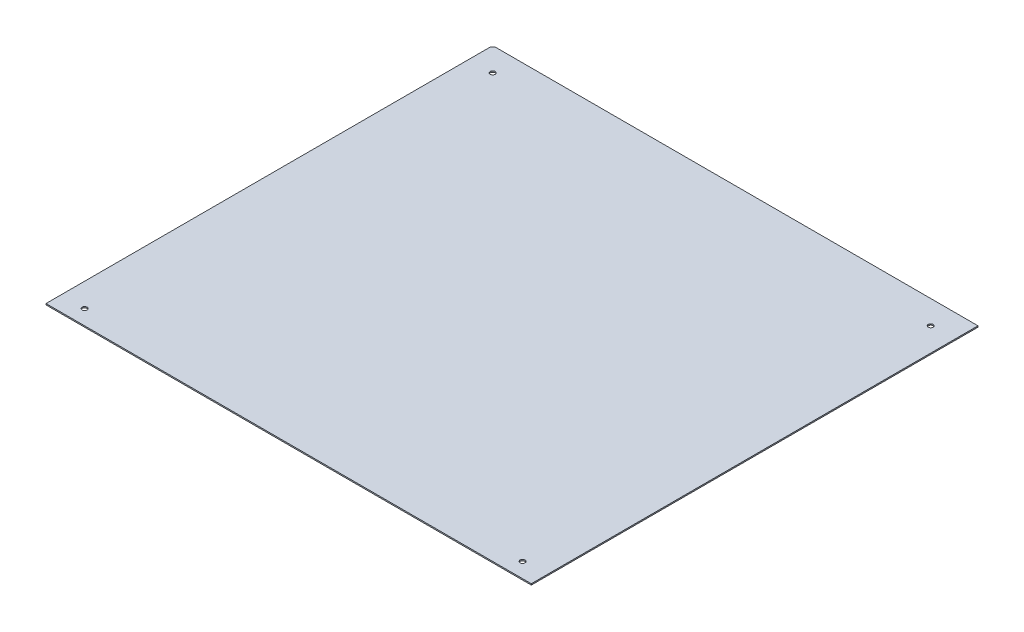
ISO-10303-21;
HEADER;
FILE_DESCRIPTION(('STEP AP214'),'2;1');
FILE_NAME('part.step','',(''),(''),'','','');
FILE_SCHEMA(('AUTOMOTIVE_DESIGN { 1 0 10303 214 1 1 1 1 }'));
ENDSEC;
DATA;
#1=APPLICATION_CONTEXT('core data for automotive mechanical design processes');
#2=APPLICATION_PROTOCOL_DEFINITION('international standard','automotive_design',2000,#1);
#3=PRODUCT_CONTEXT('',#1,'mechanical');
#4=PRODUCT('Part','Part','',(#3));
#5=PRODUCT_RELATED_PRODUCT_CATEGORY('part','',(#4));
#6=PRODUCT_DEFINITION_FORMATION('','',#4);
#7=PRODUCT_DEFINITION_CONTEXT('part definition',#1,'design');
#8=PRODUCT_DEFINITION('design','',#6,#7);
#9=PRODUCT_DEFINITION_SHAPE('','',#8);
#10=(LENGTH_UNIT() NAMED_UNIT(*) SI_UNIT(.MILLI.,.METRE.));
#11=(NAMED_UNIT(*) PLANE_ANGLE_UNIT() SI_UNIT($,.RADIAN.));
#12=(NAMED_UNIT(*) SI_UNIT($,.STERADIAN.) SOLID_ANGLE_UNIT());
#13=UNCERTAINTY_MEASURE_WITH_UNIT(LENGTH_MEASURE(1.E-05),#10,'distance_accuracy_value','');
#14=(GEOMETRIC_REPRESENTATION_CONTEXT(3) GLOBAL_UNCERTAINTY_ASSIGNED_CONTEXT((#13)) GLOBAL_UNIT_ASSIGNED_CONTEXT((#10,
#11,#12)) REPRESENTATION_CONTEXT('',''));
#15=CARTESIAN_POINT('',(0.,0.,0.));
#16=DIRECTION('',(0.,0.,1.));
#17=DIRECTION('',(1.,0.,0.));
#18=AXIS2_PLACEMENT_3D('',#15,#16,#17);
#19=CARTESIAN_POINT('',(0.,1.,0.));
#20=DIRECTION('',(0.,1.,0.));
#21=DIRECTION('',(0.,0.,1.));
#22=AXIS2_PLACEMENT_3D('',#19,#20,#21);
#23=PLANE('',#22);
#24=DIRECTION('',(-1.,0.,0.));
#25=VECTOR('',#24,1.);
#26=CARTESIAN_POINT('',(-195.,1.,179.));
#27=LINE('',#26,#25);
#28=CARTESIAN_POINT('',(195.,1.,179.));
#29=VERTEX_POINT('',#28);
#30=CARTESIAN_POINT('',(-195.,1.,179.));
#31=VERTEX_POINT('',#30);
#32=EDGE_CURVE('E89',#29,#31,#27,.T.);
#33=ORIENTED_EDGE('',*,*,#32,.F.);
#34=DIRECTION('',(0.,0.,-1.));
#35=VECTOR('',#34,1.);
#36=CARTESIAN_POINT('',(195.,1.,180.));
#37=LINE('',#36,#35);
#38=CARTESIAN_POINT('',(195.,1.,-180.));
#39=VERTEX_POINT('',#38);
#40=EDGE_CURVE('E134',#29,#39,#37,.T.);
#41=ORIENTED_EDGE('',*,*,#40,.T.);
#42=DIRECTION('',(-1.,0.,0.));
#43=VECTOR('',#42,1.);
#44=CARTESIAN_POINT('',(195.,1.,-180.));
#45=LINE('',#44,#43);
#46=CARTESIAN_POINT('',(-192.,1.,-180.));
#47=VERTEX_POINT('',#46);
#48=EDGE_CURVE('E116',#39,#47,#45,.T.);
#49=ORIENTED_EDGE('',*,*,#48,.T.);
#50=CARTESIAN_POINT('',(-192.,1.,-177.));
#51=DIRECTION('',(0.,1.,0.));
#52=DIRECTION('',(0.,0.,1.));
#53=AXIS2_PLACEMENT_3D('',#50,#51,#52);
#54=CIRCLE('',#53,3.);
#55=CARTESIAN_POINT('',(-195.,1.,-177.));
#56=VERTEX_POINT('',#55);
#57=EDGE_CURVE('E11',#47,#56,#54,.T.);
#58=ORIENTED_EDGE('',*,*,#57,.T.);
#59=DIRECTION('',(0.,0.,1.));
#60=VECTOR('',#59,1.);
#61=CARTESIAN_POINT('',(-195.,1.,180.));
#62=LINE('',#61,#60);
#63=EDGE_CURVE('E119',#56,#31,#62,.T.);
#64=ORIENTED_EDGE('',*,*,#63,.T.);
#65=EDGE_LOOP('',(#33,#41,#49,#58,#64));
#66=FACE_BOUND('',#65,.T.);
#67=CARTESIAN_POINT('',(176.,1.,-161.));
#68=DIRECTION('',(0.,1.,0.));
#69=DIRECTION('',(0.,0.,-1.));
#70=AXIS2_PLACEMENT_3D('',#67,#68,#69);
#71=CIRCLE('',#70,2.);
#72=CARTESIAN_POINT('',(176.,1.,-163.));
#73=VERTEX_POINT('',#72);
#74=EDGE_CURVE('E142',#73,#73,#71,.T.);
#75=ORIENTED_EDGE('',*,*,#74,.F.);
#76=EDGE_LOOP('',(#75));
#77=FACE_BOUND('',#76,.T.);
#78=CARTESIAN_POINT('',(-176.,1.,167.));
#79=DIRECTION('',(0.,1.,0.));
#80=DIRECTION('',(0.,0.,1.));
#81=AXIS2_PLACEMENT_3D('',#78,#79,#80);
#82=CIRCLE('',#81,2.);
#83=CARTESIAN_POINT('',(-176.,1.,169.));
#84=VERTEX_POINT('',#83);
#85=EDGE_CURVE('E108',#84,#84,#82,.T.);
#86=ORIENTED_EDGE('',*,*,#85,.F.);
#87=EDGE_LOOP('',(#86));
#88=FACE_BOUND('',#87,.T.);
#89=CARTESIAN_POINT('',(-176.,1.,-161.));
#90=DIRECTION('',(0.,1.,0.));
#91=DIRECTION('',(0.,0.,1.));
#92=AXIS2_PLACEMENT_3D('',#89,#90,#91);
#93=CIRCLE('',#92,2.);
#94=CARTESIAN_POINT('',(-176.,1.,-159.));
#95=VERTEX_POINT('',#94);
#96=EDGE_CURVE('E137',#95,#95,#93,.T.);
#97=ORIENTED_EDGE('',*,*,#96,.F.);
#98=EDGE_LOOP('',(#97));
#99=FACE_BOUND('',#98,.T.);
#100=CARTESIAN_POINT('',(176.,1.,167.));
#101=DIRECTION('',(0.,1.,0.));
#102=DIRECTION('',(0.,0.,-1.));
#103=AXIS2_PLACEMENT_3D('',#100,#101,#102);
#104=CIRCLE('',#103,2.);
#105=CARTESIAN_POINT('',(176.,1.,165.));
#106=VERTEX_POINT('',#105);
#107=EDGE_CURVE('E146',#106,#106,#104,.T.);
#108=ORIENTED_EDGE('',*,*,#107,.F.);
#109=EDGE_LOOP('',(#108));
#110=FACE_BOUND('',#109,.T.);
#111=ADVANCED_FACE('F39',(#66,#77,#88,#99,#110),#23,.T.);
#112=CARTESIAN_POINT('',(0.,0.,0.));
#113=DIRECTION('',(0.,1.,0.));
#114=DIRECTION('',(0.,0.,1.));
#115=AXIS2_PLACEMENT_3D('',#112,#113,#114);
#116=PLANE('',#115);
#117=DIRECTION('',(0.,0.,-1.));
#118=VECTOR('',#117,1.);
#119=CARTESIAN_POINT('',(195.,0.,180.));
#120=LINE('',#119,#118);
#121=CARTESIAN_POINT('',(195.,0.,179.));
#122=VERTEX_POINT('',#121);
#123=CARTESIAN_POINT('',(195.,0.,-180.));
#124=VERTEX_POINT('',#123);
#125=EDGE_CURVE('E105',#122,#124,#120,.T.);
#126=ORIENTED_EDGE('',*,*,#125,.F.);
#127=DIRECTION('',(-1.,0.,0.));
#128=VECTOR('',#127,1.);
#129=CARTESIAN_POINT('',(-195.,0.,179.));
#130=LINE('',#129,#128);
#131=CARTESIAN_POINT('',(-195.,0.,179.));
#132=VERTEX_POINT('',#131);
#133=EDGE_CURVE('E53',#122,#132,#130,.T.);
#134=ORIENTED_EDGE('',*,*,#133,.T.);
#135=DIRECTION('',(0.,0.,1.));
#136=VECTOR('',#135,1.);
#137=CARTESIAN_POINT('',(-195.,0.,180.));
#138=LINE('',#137,#136);
#139=CARTESIAN_POINT('',(-195.,0.,-177.));
#140=VERTEX_POINT('',#139);
#141=EDGE_CURVE('E99',#140,#132,#138,.T.);
#142=ORIENTED_EDGE('',*,*,#141,.F.);
#143=CARTESIAN_POINT('',(-192.,0.,-177.));
#144=DIRECTION('',(0.,1.,0.));
#145=DIRECTION('',(0.,0.,1.));
#146=AXIS2_PLACEMENT_3D('',#143,#144,#145);
#147=CIRCLE('',#146,3.);
#148=CARTESIAN_POINT('',(-192.,0.,-180.));
#149=VERTEX_POINT('',#148);
#150=EDGE_CURVE('E123',#140,#149,#147,.F.);
#151=ORIENTED_EDGE('',*,*,#150,.T.);
#152=DIRECTION('',(-1.,0.,0.));
#153=VECTOR('',#152,1.);
#154=CARTESIAN_POINT('',(195.,0.,-180.));
#155=LINE('',#154,#153);
#156=EDGE_CURVE('E109',#124,#149,#155,.T.);
#157=ORIENTED_EDGE('',*,*,#156,.F.);
#158=EDGE_LOOP('',(#126,#134,#142,#151,#157));
#159=FACE_BOUND('',#158,.T.);
#160=CARTESIAN_POINT('',(-176.,0.,167.));
#161=DIRECTION('',(0.,1.,0.));
#162=DIRECTION('',(0.,0.,1.));
#163=AXIS2_PLACEMENT_3D('',#160,#161,#162);
#164=CIRCLE('',#163,2.);
#165=CARTESIAN_POINT('',(-176.,0.,169.));
#166=VERTEX_POINT('',#165);
#167=EDGE_CURVE('E113',#166,#166,#164,.T.);
#168=ORIENTED_EDGE('',*,*,#167,.T.);
#169=EDGE_LOOP('',(#168));
#170=FACE_BOUND('',#169,.T.);
#171=CARTESIAN_POINT('',(-176.,0.,-161.));
#172=DIRECTION('',(0.,1.,0.));
#173=DIRECTION('',(0.,0.,1.));
#174=AXIS2_PLACEMENT_3D('',#171,#172,#173);
#175=CIRCLE('',#174,2.);
#176=CARTESIAN_POINT('',(-176.,0.,-159.));
#177=VERTEX_POINT('',#176);
#178=EDGE_CURVE('E139',#177,#177,#175,.T.);
#179=ORIENTED_EDGE('',*,*,#178,.T.);
#180=EDGE_LOOP('',(#179));
#181=FACE_BOUND('',#180,.T.);
#182=CARTESIAN_POINT('',(176.,0.,-161.));
#183=DIRECTION('',(0.,1.,0.));
#184=DIRECTION('',(0.,0.,-1.));
#185=AXIS2_PLACEMENT_3D('',#182,#183,#184);
#186=CIRCLE('',#185,2.);
#187=CARTESIAN_POINT('',(176.,0.,-163.));
#188=VERTEX_POINT('',#187);
#189=EDGE_CURVE('E144',#188,#188,#186,.T.);
#190=ORIENTED_EDGE('',*,*,#189,.T.);
#191=EDGE_LOOP('',(#190));
#192=FACE_BOUND('',#191,.T.);
#193=CARTESIAN_POINT('',(176.,0.,167.));
#194=DIRECTION('',(0.,1.,0.));
#195=DIRECTION('',(0.,0.,-1.));
#196=AXIS2_PLACEMENT_3D('',#193,#194,#195);
#197=CIRCLE('',#196,2.);
#198=CARTESIAN_POINT('',(176.,0.,165.));
#199=VERTEX_POINT('',#198);
#200=EDGE_CURVE('E95',#199,#199,#197,.T.);
#201=ORIENTED_EDGE('',*,*,#200,.T.);
#202=EDGE_LOOP('',(#201));
#203=FACE_BOUND('',#202,.T.);
#204=ADVANCED_FACE('F96',(#159,#170,#181,#192,#203),#116,.F.);
#205=CARTESIAN_POINT('',(-195.,1.,180.));
#206=DIRECTION('',(1.,0.,0.));
#207=DIRECTION('',(0.,0.,-1.));
#208=AXIS2_PLACEMENT_3D('',#205,#206,#207);
#209=PLANE('',#208);
#210=ORIENTED_EDGE('',*,*,#141,.T.);
#211=DIRECTION('',(0.,1.,0.));
#212=VECTOR('',#211,1.);
#213=CARTESIAN_POINT('',(-195.,0.,179.));
#214=LINE('',#213,#212);
#215=EDGE_CURVE('E83',#132,#31,#214,.T.);
#216=ORIENTED_EDGE('',*,*,#215,.T.);
#217=ORIENTED_EDGE('',*,*,#63,.F.);
#218=DIRECTION('',(0.,-1.,0.));
#219=VECTOR('',#218,1.);
#220=CARTESIAN_POINT('',(-195.,1.,-177.));
#221=LINE('',#220,#219);
#222=EDGE_CURVE('E110',#56,#140,#221,.T.);
#223=ORIENTED_EDGE('',*,*,#222,.T.);
#224=EDGE_LOOP('',(#210,#216,#217,#223));
#225=FACE_BOUND('',#224,.T.);
#226=ADVANCED_FACE('F102',(#225),#209,.F.);
#227=CARTESIAN_POINT('',(195.,1.,180.));
#228=DIRECTION('',(-1.,0.,0.));
#229=DIRECTION('',(0.,0.,1.));
#230=AXIS2_PLACEMENT_3D('',#227,#228,#229);
#231=PLANE('',#230);
#232=ORIENTED_EDGE('',*,*,#40,.F.);
#233=DIRECTION('',(0.,1.,0.));
#234=VECTOR('',#233,1.);
#235=CARTESIAN_POINT('',(195.,0.,179.));
#236=LINE('',#235,#234);
#237=EDGE_CURVE('E94',#122,#29,#236,.T.);
#238=ORIENTED_EDGE('',*,*,#237,.F.);
#239=ORIENTED_EDGE('',*,*,#125,.T.);
#240=DIRECTION('',(0.,-1.,0.));
#241=VECTOR('',#240,1.);
#242=CARTESIAN_POINT('',(195.,1.,-180.));
#243=LINE('',#242,#241);
#244=EDGE_CURVE('E122',#39,#124,#243,.T.);
#245=ORIENTED_EDGE('',*,*,#244,.F.);
#246=EDGE_LOOP('',(#232,#238,#239,#245));
#247=FACE_BOUND('',#246,.T.);
#248=ADVANCED_FACE('F160',(#247),#231,.F.);
#249=CARTESIAN_POINT('',(195.,1.,-180.));
#250=DIRECTION('',(0.,0.,1.));
#251=DIRECTION('',(1.,0.,0.));
#252=AXIS2_PLACEMENT_3D('',#249,#250,#251);
#253=PLANE('',#252);
#254=ORIENTED_EDGE('',*,*,#156,.T.);
#255=DIRECTION('',(0.,-1.,0.));
#256=VECTOR('',#255,1.);
#257=CARTESIAN_POINT('',(-192.,1.,-180.));
#258=LINE('',#257,#256);
#259=EDGE_CURVE('E50',#149,#47,#258,.F.);
#260=ORIENTED_EDGE('',*,*,#259,.T.);
#261=ORIENTED_EDGE('',*,*,#48,.F.);
#262=ORIENTED_EDGE('',*,*,#244,.T.);
#263=EDGE_LOOP('',(#254,#260,#261,#262));
#264=FACE_BOUND('',#263,.T.);
#265=ADVANCED_FACE('F126',(#264),#253,.F.);
#266=CARTESIAN_POINT('',(-176.,1.,167.));
#267=DIRECTION('',(0.,-1.,0.));
#268=DIRECTION('',(0.,0.,-1.));
#269=AXIS2_PLACEMENT_3D('',#266,#267,#268);
#270=CYLINDRICAL_SURFACE('',#269,2.);
#271=ORIENTED_EDGE('',*,*,#85,.T.);
#272=EDGE_LOOP('',(#271));
#273=FACE_BOUND('',#272,.T.);
#274=ORIENTED_EDGE('',*,*,#167,.F.);
#275=EDGE_LOOP('',(#274));
#276=FACE_BOUND('',#275,.T.);
#277=ADVANCED_FACE('F164',(#273,#276),#270,.F.);
#278=CARTESIAN_POINT('',(-176.,1.,-161.));
#279=DIRECTION('',(0.,-1.,0.));
#280=DIRECTION('',(0.,0.,-1.));
#281=AXIS2_PLACEMENT_3D('',#278,#279,#280);
#282=CYLINDRICAL_SURFACE('',#281,2.);
#283=ORIENTED_EDGE('',*,*,#96,.T.);
#284=EDGE_LOOP('',(#283));
#285=FACE_BOUND('',#284,.T.);
#286=ORIENTED_EDGE('',*,*,#178,.F.);
#287=EDGE_LOOP('',(#286));
#288=FACE_BOUND('',#287,.T.);
#289=ADVANCED_FACE('F180',(#285,#288),#282,.F.);
#290=CARTESIAN_POINT('',(176.,1.,-161.));
#291=DIRECTION('',(0.,-1.,0.));
#292=DIRECTION('',(0.,0.,-1.));
#293=AXIS2_PLACEMENT_3D('',#290,#291,#292);
#294=CYLINDRICAL_SURFACE('',#293,2.);
#295=ORIENTED_EDGE('',*,*,#74,.T.);
#296=EDGE_LOOP('',(#295));
#297=FACE_BOUND('',#296,.T.);
#298=ORIENTED_EDGE('',*,*,#189,.F.);
#299=EDGE_LOOP('',(#298));
#300=FACE_BOUND('',#299,.T.);
#301=ADVANCED_FACE('F181',(#297,#300),#294,.F.);
#302=CARTESIAN_POINT('',(176.,1.,167.));
#303=DIRECTION('',(0.,-1.,0.));
#304=DIRECTION('',(0.,0.,-1.));
#305=AXIS2_PLACEMENT_3D('',#302,#303,#304);
#306=CYLINDRICAL_SURFACE('',#305,2.);
#307=ORIENTED_EDGE('',*,*,#107,.T.);
#308=EDGE_LOOP('',(#307));
#309=FACE_BOUND('',#308,.T.);
#310=ORIENTED_EDGE('',*,*,#200,.F.);
#311=EDGE_LOOP('',(#310));
#312=FACE_BOUND('',#311,.T.);
#313=ADVANCED_FACE('F184',(#309,#312),#306,.F.);
#314=CARTESIAN_POINT('',(-192.,1.,-177.));
#315=DIRECTION('',(0.,-1.,0.));
#316=DIRECTION('',(0.,0.,-1.));
#317=AXIS2_PLACEMENT_3D('',#314,#315,#316);
#318=CYLINDRICAL_SURFACE('',#317,3.);
#319=ORIENTED_EDGE('',*,*,#57,.F.);
#320=ORIENTED_EDGE('',*,*,#259,.F.);
#321=ORIENTED_EDGE('',*,*,#150,.F.);
#322=ORIENTED_EDGE('',*,*,#222,.F.);
#323=EDGE_LOOP('',(#319,#320,#321,#322));
#324=FACE_BOUND('',#323,.T.);
#325=ADVANCED_FACE('F41',(#324),#318,.T.);
#326=CARTESIAN_POINT('',(-195.,0.,179.));
#327=DIRECTION('',(0.,0.,-1.));
#328=DIRECTION('',(-1.,0.,0.));
#329=AXIS2_PLACEMENT_3D('',#326,#327,#328);
#330=PLANE('',#329);
#331=ORIENTED_EDGE('',*,*,#32,.T.);
#332=ORIENTED_EDGE('',*,*,#215,.F.);
#333=ORIENTED_EDGE('',*,*,#133,.F.);
#334=ORIENTED_EDGE('',*,*,#237,.T.);
#335=EDGE_LOOP('',(#331,#332,#333,#334));
#336=FACE_BOUND('',#335,.T.);
#337=ADVANCED_FACE('F82',(#336),#330,.F.);
#338=CLOSED_SHELL('',(#111,#204,#226,#248,#265,#277,#289,#301,#313,#325,#337));
#339=MANIFOLD_SOLID_BREP('B2',#338);
#340=ADVANCED_BREP_SHAPE_REPRESENTATION('',(#18,#339),#14);
#341=SHAPE_DEFINITION_REPRESENTATION(#9,#340);
ENDSEC;
END-ISO-10303-21;
